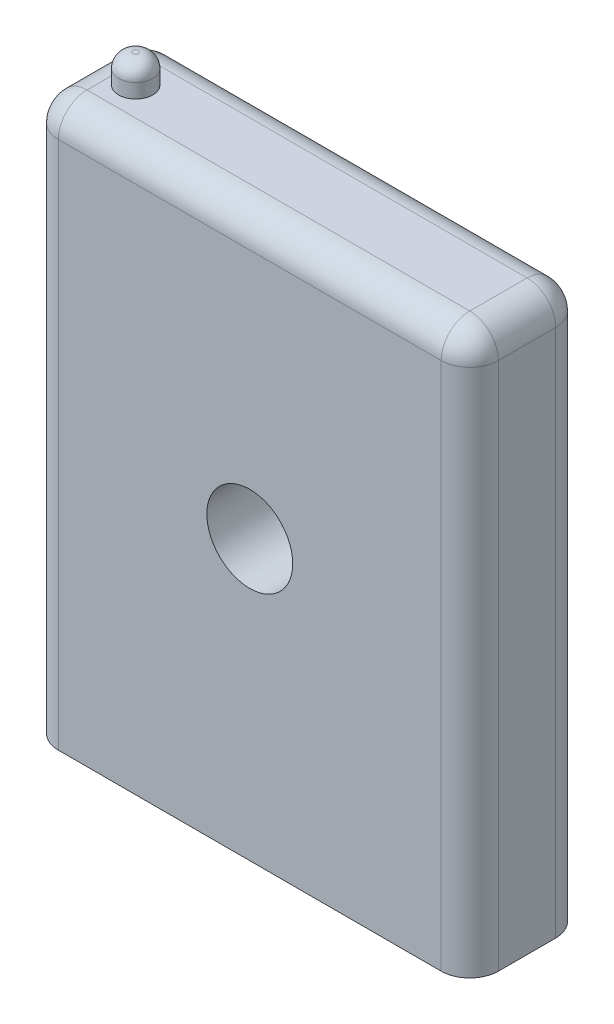
ISO-10303-21;
HEADER;
FILE_DESCRIPTION(('STEP AP214'),'2;1');
FILE_NAME('part.step','',(''),(''),'','','');
FILE_SCHEMA(('AUTOMOTIVE_DESIGN { 1 0 10303 214 1 1 1 1 }'));
ENDSEC;
DATA;
#1=APPLICATION_CONTEXT('core data for automotive mechanical design processes');
#2=APPLICATION_PROTOCOL_DEFINITION('international standard','automotive_design',2000,#1);
#3=PRODUCT_CONTEXT('',#1,'mechanical');
#4=PRODUCT('Part','Part','',(#3));
#5=PRODUCT_RELATED_PRODUCT_CATEGORY('part','',(#4));
#6=PRODUCT_DEFINITION_FORMATION('','',#4);
#7=PRODUCT_DEFINITION_CONTEXT('part definition',#1,'design');
#8=PRODUCT_DEFINITION('design','',#6,#7);
#9=PRODUCT_DEFINITION_SHAPE('','',#8);
#10=(LENGTH_UNIT() NAMED_UNIT(*) SI_UNIT(.MILLI.,.METRE.));
#11=(NAMED_UNIT(*) PLANE_ANGLE_UNIT() SI_UNIT($,.RADIAN.));
#12=(NAMED_UNIT(*) SI_UNIT($,.STERADIAN.) SOLID_ANGLE_UNIT());
#13=UNCERTAINTY_MEASURE_WITH_UNIT(LENGTH_MEASURE(1.E-05),#10,'distance_accuracy_value','');
#14=(GEOMETRIC_REPRESENTATION_CONTEXT(3) GLOBAL_UNCERTAINTY_ASSIGNED_CONTEXT((#13)) GLOBAL_UNIT_ASSIGNED_CONTEXT((#10,
#11,#12)) REPRESENTATION_CONTEXT('',''));
#15=CARTESIAN_POINT('',(0.,0.,0.));
#16=DIRECTION('',(0.,0.,1.));
#17=DIRECTION('',(1.,0.,0.));
#18=AXIS2_PLACEMENT_3D('',#15,#16,#17);
#19=CARTESIAN_POINT('',(-2.22479629028871,20.0231666125985,20.));
#20=DIRECTION('',(1.,0.,0.));
#21=DIRECTION('',(0.,1.,0.));
#22=AXIS2_PLACEMENT_3D('',#19,#20,#21);
#23=PLANE('',#22);
#24=DIRECTION('',(0.,0.,-1.));
#25=VECTOR('',#24,1.);
#26=CARTESIAN_POINT('',(-2.2247962902887,-77.3734709844856,20.));
#27=LINE('',#26,#25);
#28=CARTESIAN_POINT('',(-2.2247962902887,-77.3734709844856,15.));
#29=VERTEX_POINT('',#28);
#30=CARTESIAN_POINT('',(-2.2247962902887,-77.3734709844856,5.));
#31=VERTEX_POINT('',#30);
#32=EDGE_CURVE('E301',#29,#31,#27,.T.);
#33=ORIENTED_EDGE('',*,*,#32,.F.);
#34=DIRECTION('',(0.,-1.,0.));
#35=VECTOR('',#34,1.);
#36=CARTESIAN_POINT('',(-2.22479629028871,15.0231666125985,15.));
#37=LINE('',#36,#35);
#38=CARTESIAN_POINT('',(-2.22479629028871,15.0231666125985,15.));
#39=VERTEX_POINT('',#38);
#40=EDGE_CURVE('E190',#29,#39,#37,.F.);
#41=ORIENTED_EDGE('',*,*,#40,.T.);
#42=DIRECTION('',(0.,0.,-1.));
#43=VECTOR('',#42,1.);
#44=CARTESIAN_POINT('',(-2.22479629028871,15.0231666125985,20.));
#45=LINE('',#44,#43);
#46=CARTESIAN_POINT('',(-2.22479629028871,15.0231666125985,5.));
#47=VERTEX_POINT('',#46);
#48=EDGE_CURVE('E186',#39,#47,#45,.T.);
#49=ORIENTED_EDGE('',*,*,#48,.T.);
#50=DIRECTION('',(0.,-1.,0.));
#51=VECTOR('',#50,1.);
#52=CARTESIAN_POINT('',(-2.22479629028871,20.0231666125985,5.));
#53=LINE('',#52,#51);
#54=EDGE_CURVE('E188',#47,#31,#53,.T.);
#55=ORIENTED_EDGE('',*,*,#54,.T.);
#56=EDGE_LOOP('',(#33,#41,#49,#55));
#57=FACE_BOUND('',#56,.T.);
#58=ADVANCED_FACE('F40',(#57),#23,.F.);
#59=CARTESIAN_POINT('',(-2.2247962902887,-77.3734709844856,20.));
#60=DIRECTION('',(0.,1.,0.));
#61=DIRECTION('',(0.,0.,1.));
#62=AXIS2_PLACEMENT_3D('',#59,#60,#61);
#63=PLANE('',#62);
#64=DIRECTION('',(1.,0.,0.));
#65=VECTOR('',#64,1.);
#66=CARTESIAN_POINT('',(-2.2247962902887,-77.3734709844856,20.));
#67=LINE('',#66,#65);
#68=CARTESIAN_POINT('',(2.7752037097113,-77.3734709844856,20.));
#69=VERTEX_POINT('',#68);
#70=CARTESIAN_POINT('',(69.6542755185772,-77.3734709844856,20.));
#71=VERTEX_POINT('',#70);
#72=EDGE_CURVE('E120',#69,#71,#67,.T.);
#73=ORIENTED_EDGE('',*,*,#72,.F.);
#74=CARTESIAN_POINT('',(2.7752037097113,-77.3734709844856,15.));
#75=DIRECTION('',(0.,1.,0.));
#76=DIRECTION('',(0.,0.,1.));
#77=AXIS2_PLACEMENT_3D('',#74,#75,#76);
#78=CIRCLE('',#77,5.);
#79=EDGE_CURVE('E184',#69,#29,#78,.F.);
#80=ORIENTED_EDGE('',*,*,#79,.T.);
#81=ORIENTED_EDGE('',*,*,#32,.T.);
#82=CARTESIAN_POINT('',(2.7752037097113,-77.3734709844856,5.));
#83=DIRECTION('',(0.,1.,0.));
#84=DIRECTION('',(0.,0.,1.));
#85=AXIS2_PLACEMENT_3D('',#82,#83,#84);
#86=CIRCLE('',#85,5.);
#87=CARTESIAN_POINT('',(2.7752037097113,-77.3734709844856,0.));
#88=VERTEX_POINT('',#87);
#89=EDGE_CURVE('E182',#31,#88,#86,.F.);
#90=ORIENTED_EDGE('',*,*,#89,.T.);
#91=DIRECTION('',(1.,0.,0.));
#92=VECTOR('',#91,1.);
#93=CARTESIAN_POINT('',(-2.2247962902887,-77.3734709844856,0.));
#94=LINE('',#93,#92);
#95=CARTESIAN_POINT('',(69.6542755185772,-77.3734709844856,0.));
#96=VERTEX_POINT('',#95);
#97=EDGE_CURVE('E130',#88,#96,#94,.T.);
#98=ORIENTED_EDGE('',*,*,#97,.T.);
#99=CARTESIAN_POINT('',(69.6542755185772,-77.3734709844856,5.));
#100=DIRECTION('',(0.,1.,0.));
#101=DIRECTION('',(0.,0.,1.));
#102=AXIS2_PLACEMENT_3D('',#99,#100,#101);
#103=CIRCLE('',#102,5.);
#104=CARTESIAN_POINT('',(74.6542755185772,-77.3734709844856,5.));
#105=VERTEX_POINT('',#104);
#106=EDGE_CURVE('E170',#96,#105,#103,.F.);
#107=ORIENTED_EDGE('',*,*,#106,.T.);
#108=DIRECTION('',(0.,0.,-1.));
#109=VECTOR('',#108,1.);
#110=CARTESIAN_POINT('',(74.6542755185772,-77.3734709844856,20.));
#111=LINE('',#110,#109);
#112=CARTESIAN_POINT('',(74.6542755185772,-77.3734709844856,15.));
#113=VERTEX_POINT('',#112);
#114=EDGE_CURVE('E129',#113,#105,#111,.T.);
#115=ORIENTED_EDGE('',*,*,#114,.F.);
#116=CARTESIAN_POINT('',(69.6542755185772,-77.3734709844856,15.));
#117=DIRECTION('',(0.,1.,0.));
#118=DIRECTION('',(0.,0.,1.));
#119=AXIS2_PLACEMENT_3D('',#116,#117,#118);
#120=CIRCLE('',#119,5.);
#121=EDGE_CURVE('E134',#113,#71,#120,.F.);
#122=ORIENTED_EDGE('',*,*,#121,.T.);
#123=EDGE_LOOP('',(#73,#80,#81,#90,#98,#107,#115,#122));
#124=FACE_BOUND('',#123,.T.);
#125=ADVANCED_FACE('F135',(#124),#63,.F.);
#126=CARTESIAN_POINT('',(74.6542755185772,20.0231666125985,20.));
#127=DIRECTION('',(-1.,0.,0.));
#128=DIRECTION('',(0.,-1.,0.));
#129=AXIS2_PLACEMENT_3D('',#126,#127,#128);
#130=PLANE('',#129);
#131=ORIENTED_EDGE('',*,*,#114,.T.);
#132=DIRECTION('',(0.,1.,0.));
#133=VECTOR('',#132,1.);
#134=CARTESIAN_POINT('',(74.6542755185772,20.0231666125985,5.));
#135=LINE('',#134,#133);
#136=CARTESIAN_POINT('',(74.6542755185772,15.0231666125985,5.));
#137=VERTEX_POINT('',#136);
#138=EDGE_CURVE('E157',#105,#137,#135,.T.);
#139=ORIENTED_EDGE('',*,*,#138,.T.);
#140=DIRECTION('',(0.,0.,-1.));
#141=VECTOR('',#140,1.);
#142=CARTESIAN_POINT('',(74.6542755185772,15.0231666125985,20.));
#143=LINE('',#142,#141);
#144=CARTESIAN_POINT('',(74.6542755185772,15.0231666125985,15.));
#145=VERTEX_POINT('',#144);
#146=EDGE_CURVE('E149',#137,#145,#143,.F.);
#147=ORIENTED_EDGE('',*,*,#146,.T.);
#148=DIRECTION('',(0.,1.,0.));
#149=VECTOR('',#148,1.);
#150=CARTESIAN_POINT('',(74.6542755185772,-77.3734709844856,15.));
#151=LINE('',#150,#149);
#152=EDGE_CURVE('E140',#145,#113,#151,.F.);
#153=ORIENTED_EDGE('',*,*,#152,.T.);
#154=EDGE_LOOP('',(#131,#139,#147,#153));
#155=FACE_BOUND('',#154,.T.);
#156=ADVANCED_FACE('F230',(#155),#130,.F.);
#157=CARTESIAN_POINT('',(-2.22479629028871,20.0231666125985,20.));
#158=DIRECTION('',(0.,-1.,0.));
#159=DIRECTION('',(0.,0.,-1.));
#160=AXIS2_PLACEMENT_3D('',#157,#158,#159);
#161=PLANE('',#160);
#162=CARTESIAN_POINT('',(6.28643274429204,20.0231666125985,10.));
#163=DIRECTION('',(0.,-1.,0.));
#164=DIRECTION('',(0.,0.,-1.));
#165=AXIS2_PLACEMENT_3D('',#162,#163,#164);
#166=CIRCLE('',#165,2.99652206946773);
#167=CARTESIAN_POINT('',(6.28643274429204,20.0231666125985,7.00347793053227));
#168=VERTEX_POINT('',#167);
#169=EDGE_CURVE('E198',#168,#168,#166,.F.);
#170=ORIENTED_EDGE('',*,*,#169,.F.);
#171=EDGE_LOOP('',(#170));
#172=FACE_BOUND('',#171,.T.);
#173=DIRECTION('',(-1.,0.,0.));
#174=VECTOR('',#173,1.);
#175=CARTESIAN_POINT('',(-2.22479629028871,20.0231666125985,5.));
#176=LINE('',#175,#174);
#177=CARTESIAN_POINT('',(69.6542755185772,20.0231666125985,5.));
#178=VERTEX_POINT('',#177);
#179=CARTESIAN_POINT('',(2.77520370971129,20.0231666125985,5.));
#180=VERTEX_POINT('',#179);
#181=EDGE_CURVE('E174',#178,#180,#176,.T.);
#182=ORIENTED_EDGE('',*,*,#181,.T.);
#183=DIRECTION('',(0.,0.,-1.));
#184=VECTOR('',#183,1.);
#185=CARTESIAN_POINT('',(2.77520370971129,20.0231666125985,20.));
#186=LINE('',#185,#184);
#187=CARTESIAN_POINT('',(2.77520370971129,20.0231666125985,15.));
#188=VERTEX_POINT('',#187);
#189=EDGE_CURVE('E196',#180,#188,#186,.F.);
#190=ORIENTED_EDGE('',*,*,#189,.T.);
#191=DIRECTION('',(-1.,0.,0.));
#192=VECTOR('',#191,1.);
#193=CARTESIAN_POINT('',(69.6542755185772,20.0231666125985,15.));
#194=LINE('',#193,#192);
#195=CARTESIAN_POINT('',(69.6542755185772,20.0231666125985,15.));
#196=VERTEX_POINT('',#195);
#197=EDGE_CURVE('E155',#188,#196,#194,.F.);
#198=ORIENTED_EDGE('',*,*,#197,.T.);
#199=DIRECTION('',(0.,0.,-1.));
#200=VECTOR('',#199,1.);
#201=CARTESIAN_POINT('',(69.6542755185772,20.0231666125985,20.));
#202=LINE('',#201,#200);
#203=EDGE_CURVE('E298',#196,#178,#202,.T.);
#204=ORIENTED_EDGE('',*,*,#203,.T.);
#205=EDGE_LOOP('',(#182,#190,#198,#204));
#206=FACE_BOUND('',#205,.T.);
#207=ADVANCED_FACE('F291',(#172,#206),#161,.F.);
#208=CARTESIAN_POINT('',(0.,0.,20.));
#209=DIRECTION('',(0.,0.,1.));
#210=DIRECTION('',(1.,0.,0.));
#211=AXIS2_PLACEMENT_3D('',#208,#209,#210);
#212=PLANE('',#211);
#213=CARTESIAN_POINT('',(36.2147396141442,-28.6751521859436,20.));
#214=DIRECTION('',(0.,0.,1.));
#215=DIRECTION('',(1.,0.,0.));
#216=AXIS2_PLACEMENT_3D('',#213,#214,#215);
#217=CIRCLE('',#216,7.5);
#218=CARTESIAN_POINT('',(43.7147396141442,-28.6751521859436,20.));
#219=VERTEX_POINT('',#218);
#220=EDGE_CURVE('E162',#219,#219,#217,.T.);
#221=ORIENTED_EDGE('',*,*,#220,.F.);
#222=EDGE_LOOP('',(#221));
#223=FACE_BOUND('',#222,.T.);
#224=DIRECTION('',(-1.,0.,0.));
#225=VECTOR('',#224,1.);
#226=CARTESIAN_POINT('',(-2.22479629028871,15.0231666125985,20.));
#227=LINE('',#226,#225);
#228=CARTESIAN_POINT('',(69.6542755185772,15.0231666125985,20.));
#229=VERTEX_POINT('',#228);
#230=CARTESIAN_POINT('',(2.77520370971129,15.0231666125985,20.));
#231=VERTEX_POINT('',#230);
#232=EDGE_CURVE('E146',#229,#231,#227,.T.);
#233=ORIENTED_EDGE('',*,*,#232,.T.);
#234=DIRECTION('',(0.,-1.,0.));
#235=VECTOR('',#234,1.);
#236=CARTESIAN_POINT('',(2.7752037097113,-77.3734709844856,20.));
#237=LINE('',#236,#235);
#238=EDGE_CURVE('E127',#231,#69,#237,.T.);
#239=ORIENTED_EDGE('',*,*,#238,.T.);
#240=ORIENTED_EDGE('',*,*,#72,.T.);
#241=DIRECTION('',(0.,1.,0.));
#242=VECTOR('',#241,1.);
#243=CARTESIAN_POINT('',(69.6542755185772,15.0231666125985,20.));
#244=LINE('',#243,#242);
#245=EDGE_CURVE('E125',#71,#229,#244,.T.);
#246=ORIENTED_EDGE('',*,*,#245,.T.);
#247=EDGE_LOOP('',(#233,#239,#240,#246));
#248=FACE_BOUND('',#247,.T.);
#249=ADVANCED_FACE('F123',(#223,#248),#212,.T.);
#250=CARTESIAN_POINT('',(0.,0.,0.));
#251=DIRECTION('',(0.,0.,1.));
#252=DIRECTION('',(1.,0.,0.));
#253=AXIS2_PLACEMENT_3D('',#250,#251,#252);
#254=PLANE('',#253);
#255=CARTESIAN_POINT('',(36.2147396141442,-28.6751521859436,0.));
#256=DIRECTION('',(0.,0.,1.));
#257=DIRECTION('',(1.,0.,0.));
#258=AXIS2_PLACEMENT_3D('',#255,#256,#257);
#259=CIRCLE('',#258,7.5);
#260=CARTESIAN_POINT('',(43.7147396141442,-28.6751521859436,0.));
#261=VERTEX_POINT('',#260);
#262=EDGE_CURVE('E307',#261,#261,#259,.T.);
#263=ORIENTED_EDGE('',*,*,#262,.T.);
#264=EDGE_LOOP('',(#263));
#265=FACE_BOUND('',#264,.T.);
#266=ORIENTED_EDGE('',*,*,#97,.F.);
#267=DIRECTION('',(0.,-1.,0.));
#268=VECTOR('',#267,1.);
#269=CARTESIAN_POINT('',(2.77520370971129,0.,0.));
#270=LINE('',#269,#268);
#271=CARTESIAN_POINT('',(2.77520370971129,15.0231666125985,0.));
#272=VERTEX_POINT('',#271);
#273=EDGE_CURVE('E63',#88,#272,#270,.F.);
#274=ORIENTED_EDGE('',*,*,#273,.T.);
#275=DIRECTION('',(-1.,0.,0.));
#276=VECTOR('',#275,1.);
#277=CARTESIAN_POINT('',(0.,15.0231666125985,0.));
#278=LINE('',#277,#276);
#279=CARTESIAN_POINT('',(69.6542755185772,15.0231666125985,0.));
#280=VERTEX_POINT('',#279);
#281=EDGE_CURVE('E165',#272,#280,#278,.F.);
#282=ORIENTED_EDGE('',*,*,#281,.T.);
#283=DIRECTION('',(0.,1.,0.));
#284=VECTOR('',#283,1.);
#285=CARTESIAN_POINT('',(69.6542755185772,0.,0.));
#286=LINE('',#285,#284);
#287=EDGE_CURVE('E167',#280,#96,#286,.F.);
#288=ORIENTED_EDGE('',*,*,#287,.T.);
#289=EDGE_LOOP('',(#266,#274,#282,#288));
#290=FACE_BOUND('',#289,.T.);
#291=ADVANCED_FACE('F314',(#265,#290),#254,.F.);
#292=CARTESIAN_POINT('',(36.2147396141442,-28.6751521859436,0.));
#293=DIRECTION('',(0.,0.,1.));
#294=DIRECTION('',(1.,0.,0.));
#295=AXIS2_PLACEMENT_3D('',#292,#293,#294);
#296=CYLINDRICAL_SURFACE('',#295,7.5);
#297=ORIENTED_EDGE('',*,*,#262,.F.);
#298=EDGE_LOOP('',(#297));
#299=FACE_BOUND('',#298,.T.);
#300=ORIENTED_EDGE('',*,*,#220,.T.);
#301=EDGE_LOOP('',(#300));
#302=FACE_BOUND('',#301,.T.);
#303=ADVANCED_FACE('F239',(#299,#302),#296,.F.);
#304=CARTESIAN_POINT('',(69.6542755185772,15.0231666125985,20.));
#305=DIRECTION('',(0.,0.,-1.));
#306=DIRECTION('',(-1.,0.,0.));
#307=AXIS2_PLACEMENT_3D('',#304,#305,#306);
#308=CYLINDRICAL_SURFACE('',#307,5.);
#309=ORIENTED_EDGE('',*,*,#146,.F.);
#310=CARTESIAN_POINT('',(69.6542755185772,15.0231666125985,5.));
#311=DIRECTION('',(0.,0.,-1.));
#312=DIRECTION('',(-1.,0.,0.));
#313=AXIS2_PLACEMENT_3D('',#310,#311,#312);
#314=CIRCLE('',#313,5.);
#315=EDGE_CURVE('E172',#137,#178,#314,.F.);
#316=ORIENTED_EDGE('',*,*,#315,.T.);
#317=ORIENTED_EDGE('',*,*,#203,.F.);
#318=CARTESIAN_POINT('',(69.6542755185772,15.0231666125985,15.));
#319=DIRECTION('',(0.,0.,-1.));
#320=DIRECTION('',(-1.,0.,0.));
#321=AXIS2_PLACEMENT_3D('',#318,#319,#320);
#322=CIRCLE('',#321,5.);
#323=EDGE_CURVE('E139',#196,#145,#322,.T.);
#324=ORIENTED_EDGE('',*,*,#323,.T.);
#325=EDGE_LOOP('',(#309,#316,#317,#324));
#326=FACE_BOUND('',#325,.T.);
#327=ADVANCED_FACE('F235',(#326),#308,.T.);
#328=CARTESIAN_POINT('',(0.,15.0231666125985,15.));
#329=DIRECTION('',(1.,0.,0.));
#330=DIRECTION('',(0.,0.,-1.));
#331=AXIS2_PLACEMENT_3D('',#328,#329,#330);
#332=CYLINDRICAL_SURFACE('',#331,5.);
#333=ORIENTED_EDGE('',*,*,#197,.F.);
#334=CARTESIAN_POINT('',(2.77520370971129,15.0231666125985,15.));
#335=DIRECTION('',(1.,0.,0.));
#336=DIRECTION('',(0.,0.,-1.));
#337=AXIS2_PLACEMENT_3D('',#334,#335,#336);
#338=CIRCLE('',#337,5.);
#339=EDGE_CURVE('E192',#188,#231,#338,.T.);
#340=ORIENTED_EDGE('',*,*,#339,.T.);
#341=ORIENTED_EDGE('',*,*,#232,.F.);
#342=CARTESIAN_POINT('',(69.6542755185772,15.0231666125985,15.));
#343=DIRECTION('',(1.,0.,0.));
#344=DIRECTION('',(0.,0.,-1.));
#345=AXIS2_PLACEMENT_3D('',#342,#343,#344);
#346=CIRCLE('',#345,5.);
#347=EDGE_CURVE('E159',#196,#229,#346,.T.);
#348=ORIENTED_EDGE('',*,*,#347,.F.);
#349=EDGE_LOOP('',(#333,#340,#341,#348));
#350=FACE_BOUND('',#349,.T.);
#351=ADVANCED_FACE('F238',(#350),#332,.T.);
#352=CARTESIAN_POINT('',(69.6542755185772,15.0231666125985,15.));
#353=DIRECTION('',(0.,0.,1.));
#354=DIRECTION('',(1.,0.,0.));
#355=AXIS2_PLACEMENT_3D('',#352,#353,#354);
#356=SPHERICAL_SURFACE('',#355,5.);
#357=ORIENTED_EDGE('',*,*,#323,.F.);
#358=ORIENTED_EDGE('',*,*,#347,.T.);
#359=CARTESIAN_POINT('',(69.6542755185772,15.0231666125985,15.));
#360=DIRECTION('',(0.,-1.,0.));
#361=DIRECTION('',(0.,0.,-1.));
#362=AXIS2_PLACEMENT_3D('',#359,#360,#361);
#363=CIRCLE('',#362,5.);
#364=EDGE_CURVE('E144',#145,#229,#363,.T.);
#365=ORIENTED_EDGE('',*,*,#364,.F.);
#366=EDGE_LOOP('',(#357,#358,#365));
#367=FACE_BOUND('',#366,.T.);
#368=ADVANCED_FACE('F244',(#367),#356,.T.);
#369=CARTESIAN_POINT('',(69.6542755185772,0.,15.));
#370=DIRECTION('',(0.,-1.,0.));
#371=DIRECTION('',(1.,0.,0.));
#372=AXIS2_PLACEMENT_3D('',#369,#370,#371);
#373=CYLINDRICAL_SURFACE('',#372,5.);
#374=ORIENTED_EDGE('',*,*,#121,.F.);
#375=ORIENTED_EDGE('',*,*,#152,.F.);
#376=ORIENTED_EDGE('',*,*,#364,.T.);
#377=ORIENTED_EDGE('',*,*,#245,.F.);
#378=EDGE_LOOP('',(#374,#375,#376,#377));
#379=FACE_BOUND('',#378,.T.);
#380=ADVANCED_FACE('F142',(#379),#373,.T.);
#381=CARTESIAN_POINT('',(-2.22479629028871,15.0231666125985,5.));
#382=DIRECTION('',(-1.,0.,0.));
#383=DIRECTION('',(0.,0.,1.));
#384=AXIS2_PLACEMENT_3D('',#381,#382,#383);
#385=CYLINDRICAL_SURFACE('',#384,5.);
#386=ORIENTED_EDGE('',*,*,#281,.F.);
#387=CARTESIAN_POINT('',(2.77520370971129,15.0231666125985,5.));
#388=DIRECTION('',(-1.,0.,0.));
#389=DIRECTION('',(0.,0.,1.));
#390=AXIS2_PLACEMENT_3D('',#387,#388,#389);
#391=CIRCLE('',#390,5.);
#392=EDGE_CURVE('E55',#272,#180,#391,.F.);
#393=ORIENTED_EDGE('',*,*,#392,.T.);
#394=ORIENTED_EDGE('',*,*,#181,.F.);
#395=CARTESIAN_POINT('',(69.6542755185772,15.0231666125985,5.));
#396=DIRECTION('',(1.,0.,0.));
#397=DIRECTION('',(0.,0.,-1.));
#398=AXIS2_PLACEMENT_3D('',#395,#396,#397);
#399=CIRCLE('',#398,5.);
#400=EDGE_CURVE('E160',#280,#178,#399,.T.);
#401=ORIENTED_EDGE('',*,*,#400,.F.);
#402=EDGE_LOOP('',(#386,#393,#394,#401));
#403=FACE_BOUND('',#402,.T.);
#404=ADVANCED_FACE('F243',(#403),#385,.T.);
#405=CARTESIAN_POINT('',(69.6542755185772,15.0231666125985,5.));
#406=DIRECTION('',(0.,0.,1.));
#407=DIRECTION('',(1.,0.,0.));
#408=AXIS2_PLACEMENT_3D('',#405,#406,#407);
#409=SPHERICAL_SURFACE('',#408,5.);
#410=ORIENTED_EDGE('',*,*,#400,.T.);
#411=ORIENTED_EDGE('',*,*,#315,.F.);
#412=CARTESIAN_POINT('',(69.6542755185772,15.0231666125985,5.));
#413=DIRECTION('',(0.,-1.,0.));
#414=DIRECTION('',(0.,0.,-1.));
#415=AXIS2_PLACEMENT_3D('',#412,#413,#414);
#416=CIRCLE('',#415,5.);
#417=EDGE_CURVE('E176',#280,#137,#416,.T.);
#418=ORIENTED_EDGE('',*,*,#417,.F.);
#419=EDGE_LOOP('',(#410,#411,#418));
#420=FACE_BOUND('',#419,.T.);
#421=ADVANCED_FACE('F255',(#420),#409,.T.);
#422=CARTESIAN_POINT('',(69.6542755185772,20.0231666125985,5.));
#423=DIRECTION('',(0.,1.,0.));
#424=DIRECTION('',(-1.,0.,0.));
#425=AXIS2_PLACEMENT_3D('',#422,#423,#424);
#426=CYLINDRICAL_SURFACE('',#425,5.);
#427=ORIENTED_EDGE('',*,*,#106,.F.);
#428=ORIENTED_EDGE('',*,*,#287,.F.);
#429=ORIENTED_EDGE('',*,*,#417,.T.);
#430=ORIENTED_EDGE('',*,*,#138,.F.);
#431=EDGE_LOOP('',(#427,#428,#429,#430));
#432=FACE_BOUND('',#431,.T.);
#433=ADVANCED_FACE('F251',(#432),#426,.T.);
#434=CARTESIAN_POINT('',(2.77520370971129,20.0231666125985,5.));
#435=DIRECTION('',(0.,-1.,0.));
#436=DIRECTION('',(1.,0.,0.));
#437=AXIS2_PLACEMENT_3D('',#434,#435,#436);
#438=CYLINDRICAL_SURFACE('',#437,5.);
#439=CARTESIAN_POINT('',(2.77520370971129,15.0231666125985,5.));
#440=DIRECTION('',(0.,1.,0.));
#441=DIRECTION('',(0.,0.,1.));
#442=AXIS2_PLACEMENT_3D('',#439,#440,#441);
#443=CIRCLE('',#442,5.);
#444=EDGE_CURVE('E178',#272,#47,#443,.T.);
#445=ORIENTED_EDGE('',*,*,#444,.F.);
#446=ORIENTED_EDGE('',*,*,#273,.F.);
#447=ORIENTED_EDGE('',*,*,#89,.F.);
#448=ORIENTED_EDGE('',*,*,#54,.F.);
#449=EDGE_LOOP('',(#445,#446,#447,#448));
#450=FACE_BOUND('',#449,.T.);
#451=ADVANCED_FACE('F254',(#450),#438,.T.);
#452=CARTESIAN_POINT('',(2.77520370971129,15.0231666125985,5.));
#453=DIRECTION('',(1.,0.,0.));
#454=DIRECTION('',(0.,1.,0.));
#455=AXIS2_PLACEMENT_3D('',#452,#453,#454);
#456=SPHERICAL_SURFACE('',#455,5.);
#457=ORIENTED_EDGE('',*,*,#392,.F.);
#458=ORIENTED_EDGE('',*,*,#444,.T.);
#459=CARTESIAN_POINT('',(2.77520370971129,15.0231666125985,5.));
#460=DIRECTION('',(0.,0.,1.));
#461=DIRECTION('',(1.,0.,0.));
#462=AXIS2_PLACEMENT_3D('',#459,#460,#461);
#463=CIRCLE('',#462,5.);
#464=EDGE_CURVE('E205',#180,#47,#463,.T.);
#465=ORIENTED_EDGE('',*,*,#464,.F.);
#466=EDGE_LOOP('',(#457,#458,#465));
#467=FACE_BOUND('',#466,.T.);
#468=ADVANCED_FACE('F273',(#467),#456,.T.);
#469=CARTESIAN_POINT('',(2.77520370971129,15.0231666125985,20.));
#470=DIRECTION('',(0.,0.,-1.));
#471=DIRECTION('',(-1.,0.,0.));
#472=AXIS2_PLACEMENT_3D('',#469,#470,#471);
#473=CYLINDRICAL_SURFACE('',#472,5.);
#474=CARTESIAN_POINT('',(2.77520370971129,15.0231666125985,15.));
#475=DIRECTION('',(0.,0.,1.));
#476=DIRECTION('',(1.,0.,0.));
#477=AXIS2_PLACEMENT_3D('',#474,#475,#476);
#478=CIRCLE('',#477,5.);
#479=EDGE_CURVE('E202',#188,#39,#478,.T.);
#480=ORIENTED_EDGE('',*,*,#479,.F.);
#481=ORIENTED_EDGE('',*,*,#189,.F.);
#482=ORIENTED_EDGE('',*,*,#464,.T.);
#483=ORIENTED_EDGE('',*,*,#48,.F.);
#484=EDGE_LOOP('',(#480,#481,#482,#483));
#485=FACE_BOUND('',#484,.T.);
#486=ADVANCED_FACE('F269',(#485),#473,.T.);
#487=CARTESIAN_POINT('',(2.77520370971129,15.0231666125985,15.));
#488=DIRECTION('',(1.,0.,0.));
#489=DIRECTION('',(0.,1.,0.));
#490=AXIS2_PLACEMENT_3D('',#487,#488,#489);
#491=SPHERICAL_SURFACE('',#490,5.);
#492=ORIENTED_EDGE('',*,*,#339,.F.);
#493=ORIENTED_EDGE('',*,*,#479,.T.);
#494=CARTESIAN_POINT('',(2.77520370971129,15.0231666125985,15.));
#495=DIRECTION('',(0.,-1.,0.));
#496=DIRECTION('',(0.,0.,-1.));
#497=AXIS2_PLACEMENT_3D('',#494,#495,#496);
#498=CIRCLE('',#497,5.);
#499=EDGE_CURVE('E199',#231,#39,#498,.T.);
#500=ORIENTED_EDGE('',*,*,#499,.F.);
#501=EDGE_LOOP('',(#492,#493,#500));
#502=FACE_BOUND('',#501,.T.);
#503=ADVANCED_FACE('F265',(#502),#491,.T.);
#504=CARTESIAN_POINT('',(2.77520370971129,0.,15.));
#505=DIRECTION('',(0.,1.,0.));
#506=DIRECTION('',(-1.,0.,0.));
#507=AXIS2_PLACEMENT_3D('',#504,#505,#506);
#508=CYLINDRICAL_SURFACE('',#507,5.);
#509=ORIENTED_EDGE('',*,*,#499,.T.);
#510=ORIENTED_EDGE('',*,*,#40,.F.);
#511=ORIENTED_EDGE('',*,*,#79,.F.);
#512=ORIENTED_EDGE('',*,*,#238,.F.);
#513=EDGE_LOOP('',(#509,#510,#511,#512));
#514=FACE_BOUND('',#513,.T.);
#515=ADVANCED_FACE('F262',(#514),#508,.T.);
#516=CARTESIAN_POINT('',(6.28643274429204,25.0231666125985,10.));
#517=DIRECTION('',(0.,-1.,0.));
#518=DIRECTION('',(0.,0.,-1.));
#519=AXIS2_PLACEMENT_3D('',#516,#517,#518);
#520=CYLINDRICAL_SURFACE('',#519,2.99652206946773);
#521=CARTESIAN_POINT('',(6.28643274429204,22.5231666125985,10.));
#522=DIRECTION('',(0.,1.,0.));
#523=DIRECTION('',(0.,0.,1.));
#524=AXIS2_PLACEMENT_3D('',#521,#522,#523);
#525=CIRCLE('',#524,2.99652206946773);
#526=CARTESIAN_POINT('',(6.28643274429204,22.5231666125985,12.9965220694677));
#527=VERTEX_POINT('',#526);
#528=EDGE_CURVE('E11',#527,#527,#525,.F.);
#529=ORIENTED_EDGE('',*,*,#528,.T.);
#530=EDGE_LOOP('',(#529));
#531=FACE_BOUND('',#530,.T.);
#532=ORIENTED_EDGE('',*,*,#169,.T.);
#533=EDGE_LOOP('',(#532));
#534=FACE_BOUND('',#533,.T.);
#535=ADVANCED_FACE('F221',(#531,#534),#520,.T.);
#536=CARTESIAN_POINT('',(6.28643274429204,25.0231666125985,10.));
#537=DIRECTION('',(0.,1.,0.));
#538=DIRECTION('',(0.,0.,1.));
#539=AXIS2_PLACEMENT_3D('',#536,#537,#538);
#540=PLANE('',#539);
#541=CARTESIAN_POINT('',(6.28643274429204,25.0231666125985,10.));
#542=DIRECTION('',(0.,1.,0.));
#543=DIRECTION('',(0.,0.,1.));
#544=AXIS2_PLACEMENT_3D('',#541,#542,#543);
#545=CIRCLE('',#544,0.49652206946773);
#546=CARTESIAN_POINT('',(6.28643274429204,25.0231666125985,10.4965220694677));
#547=VERTEX_POINT('',#546);
#548=EDGE_CURVE('E48',#547,#547,#545,.T.);
#549=ORIENTED_EDGE('',*,*,#548,.T.);
#550=EDGE_LOOP('',(#549));
#551=FACE_BOUND('',#550,.T.);
#552=ADVANCED_FACE('F214',(#551),#540,.T.);
#553=CARTESIAN_POINT('',(6.28643274429204,22.5231666125985,10.));
#554=DIRECTION('',(0.,1.,0.));
#555=DIRECTION('',(0.,0.,1.));
#556=AXIS2_PLACEMENT_3D('',#553,#554,#555);
#557=DEGENERATE_TOROIDAL_SURFACE('',#556,0.49652206946773,2.5,.T.);
#558=ORIENTED_EDGE('',*,*,#528,.F.);
#559=EDGE_LOOP('',(#558));
#560=FACE_BOUND('',#559,.T.);
#561=ORIENTED_EDGE('',*,*,#548,.F.);
#562=EDGE_LOOP('',(#561));
#563=FACE_BOUND('',#562,.T.);
#564=ADVANCED_FACE('F42',(#560,#563),#557,.T.);
#565=CLOSED_SHELL('',(#58,#125,#156,#207,#249,#291,#303,#327,#351,#368,#380,#404,#421,#433,#451,
#468,#486,#503,#515,#535,#552,#564));
#566=MANIFOLD_SOLID_BREP('B2',#565);
#567=ADVANCED_BREP_SHAPE_REPRESENTATION('',(#18,#566),#14);
#568=SHAPE_DEFINITION_REPRESENTATION(#9,#567);
ENDSEC;
END-ISO-10303-21;
